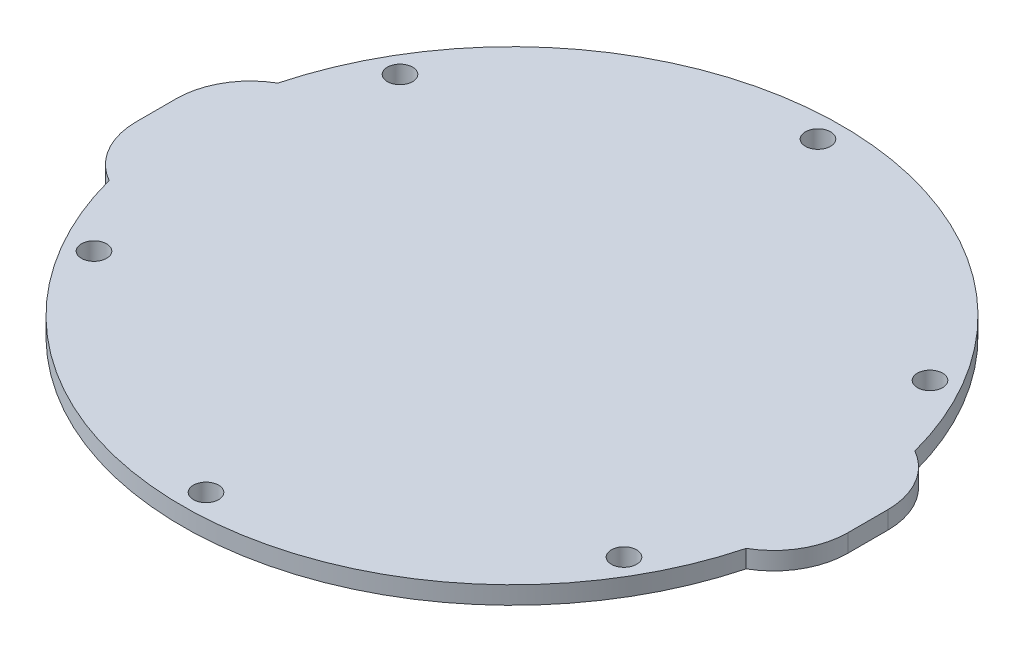
ISO-10303-21;
HEADER;
FILE_DESCRIPTION(('STEP AP214'),'2;1');
FILE_NAME('part.step','',(''),(''),'','','');
FILE_SCHEMA(('AUTOMOTIVE_DESIGN { 1 0 10303 214 1 1 1 1 }'));
ENDSEC;
DATA;
#1=APPLICATION_CONTEXT('core data for automotive mechanical design processes');
#2=APPLICATION_PROTOCOL_DEFINITION('international standard','automotive_design',2000,#1);
#3=PRODUCT_CONTEXT('',#1,'mechanical');
#4=PRODUCT('Part','Part','',(#3));
#5=PRODUCT_RELATED_PRODUCT_CATEGORY('part','',(#4));
#6=PRODUCT_DEFINITION_FORMATION('','',#4);
#7=PRODUCT_DEFINITION_CONTEXT('part definition',#1,'design');
#8=PRODUCT_DEFINITION('design','',#6,#7);
#9=PRODUCT_DEFINITION_SHAPE('','',#8);
#10=(LENGTH_UNIT() NAMED_UNIT(*) SI_UNIT(.MILLI.,.METRE.));
#11=(NAMED_UNIT(*) PLANE_ANGLE_UNIT() SI_UNIT($,.RADIAN.));
#12=(NAMED_UNIT(*) SI_UNIT($,.STERADIAN.) SOLID_ANGLE_UNIT());
#13=UNCERTAINTY_MEASURE_WITH_UNIT(LENGTH_MEASURE(1.E-05),#10,'distance_accuracy_value','');
#14=(GEOMETRIC_REPRESENTATION_CONTEXT(3) GLOBAL_UNCERTAINTY_ASSIGNED_CONTEXT((#13)) GLOBAL_UNIT_ASSIGNED_CONTEXT((#10,
#11,#12)) REPRESENTATION_CONTEXT('',''));
#15=CARTESIAN_POINT('',(0.,0.,0.));
#16=DIRECTION('',(0.,0.,1.));
#17=DIRECTION('',(1.,0.,0.));
#18=AXIS2_PLACEMENT_3D('',#15,#16,#17);
#19=CARTESIAN_POINT('',(-38.,2.4,2.7));
#20=DIRECTION('',(0.,-1.,0.));
#21=DIRECTION('',(0.,0.,-1.));
#22=AXIS2_PLACEMENT_3D('',#19,#20,#21);
#23=CYLINDRICAL_SURFACE('',#22,10.);
#24=CARTESIAN_POINT('',(-38.,0.,2.7));
#25=DIRECTION('',(0.,1.,0.));
#26=DIRECTION('',(0.,0.,1.));
#27=AXIS2_PLACEMENT_3D('',#24,#25,#26);
#28=CIRCLE('',#27,10.);
#29=CARTESIAN_POINT('',(-42.969094343859,0.,11.3780240493922));
#30=VERTEX_POINT('',#29);
#31=CARTESIAN_POINT('',(-48.,0.,2.69999999999993));
#32=VERTEX_POINT('',#31);
#33=EDGE_CURVE('E129',#30,#32,#28,.F.);
#34=ORIENTED_EDGE('',*,*,#33,.F.);
#35=DIRECTION('',(0.,-1.,0.));
#36=VECTOR('',#35,1.);
#37=CARTESIAN_POINT('',(-42.969094343859,2.4,11.3780240493922));
#38=LINE('',#37,#36);
#39=CARTESIAN_POINT('',(-42.969094343859,2.4,11.3780240493922));
#40=VERTEX_POINT('',#39);
#41=EDGE_CURVE('E11',#40,#30,#38,.T.);
#42=ORIENTED_EDGE('',*,*,#41,.F.);
#43=CARTESIAN_POINT('',(-38.,2.4,2.7));
#44=DIRECTION('',(0.,1.,0.));
#45=DIRECTION('',(0.,0.,1.));
#46=AXIS2_PLACEMENT_3D('',#43,#44,#45);
#47=CIRCLE('',#46,10.);
#48=CARTESIAN_POINT('',(-48.,2.4,2.69999999999993));
#49=VERTEX_POINT('',#48);
#50=EDGE_CURVE('E148',#40,#49,#47,.F.);
#51=ORIENTED_EDGE('',*,*,#50,.T.);
#52=DIRECTION('',(0.,-1.,0.));
#53=VECTOR('',#52,1.);
#54=CARTESIAN_POINT('',(-48.,2.4,2.69999999999993));
#55=LINE('',#54,#53);
#56=EDGE_CURVE('E87',#49,#32,#55,.T.);
#57=ORIENTED_EDGE('',*,*,#56,.T.);
#58=EDGE_LOOP('',(#34,#42,#51,#57));
#59=FACE_BOUND('',#58,.T.);
#60=ADVANCED_FACE('F36',(#59),#23,.T.);
#61=CARTESIAN_POINT('',(0.,2.4,0.));
#62=DIRECTION('',(0.,-1.,0.));
#63=DIRECTION('',(0.,0.,-1.));
#64=AXIS2_PLACEMENT_3D('',#61,#62,#63);
#65=CYLINDRICAL_SURFACE('',#64,44.45);
#66=CARTESIAN_POINT('',(0.,0.,0.));
#67=DIRECTION('',(0.,1.,0.));
#68=DIRECTION('',(0.,0.,1.));
#69=AXIS2_PLACEMENT_3D('',#66,#67,#68);
#70=CIRCLE('',#69,44.45);
#71=CARTESIAN_POINT('',(42.969094343859,0.,11.3780240493922));
#72=VERTEX_POINT('',#71);
#73=EDGE_CURVE('E132',#30,#72,#70,.T.);
#74=ORIENTED_EDGE('',*,*,#73,.T.);
#75=DIRECTION('',(0.,-1.,0.));
#76=VECTOR('',#75,1.);
#77=CARTESIAN_POINT('',(42.969094343859,2.4,11.3780240493922));
#78=LINE('',#77,#76);
#79=CARTESIAN_POINT('',(42.969094343859,2.4,11.3780240493922));
#80=VERTEX_POINT('',#79);
#81=EDGE_CURVE('E44',#80,#72,#78,.T.);
#82=ORIENTED_EDGE('',*,*,#81,.F.);
#83=CARTESIAN_POINT('',(0.,2.4,0.));
#84=DIRECTION('',(0.,1.,0.));
#85=DIRECTION('',(0.,0.,1.));
#86=AXIS2_PLACEMENT_3D('',#83,#84,#85);
#87=CIRCLE('',#86,44.45);
#88=EDGE_CURVE('E174',#40,#80,#87,.T.);
#89=ORIENTED_EDGE('',*,*,#88,.F.);
#90=ORIENTED_EDGE('',*,*,#41,.T.);
#91=EDGE_LOOP('',(#74,#82,#89,#90));
#92=FACE_BOUND('',#91,.T.);
#93=ADVANCED_FACE('F247',(#92),#65,.T.);
#94=CARTESIAN_POINT('',(38.,2.4,2.7));
#95=DIRECTION('',(0.,-1.,0.));
#96=DIRECTION('',(0.,0.,-1.));
#97=AXIS2_PLACEMENT_3D('',#94,#95,#96);
#98=CYLINDRICAL_SURFACE('',#97,10.);
#99=CARTESIAN_POINT('',(38.,0.,2.7));
#100=DIRECTION('',(0.,1.,0.));
#101=DIRECTION('',(0.,0.,1.));
#102=AXIS2_PLACEMENT_3D('',#99,#100,#101);
#103=CIRCLE('',#102,10.);
#104=CARTESIAN_POINT('',(48.,0.,2.69999999999993));
#105=VERTEX_POINT('',#104);
#106=EDGE_CURVE('E135',#72,#105,#103,.T.);
#107=ORIENTED_EDGE('',*,*,#106,.T.);
#108=DIRECTION('',(0.,-1.,0.));
#109=VECTOR('',#108,1.);
#110=CARTESIAN_POINT('',(48.,2.4,2.69999999999993));
#111=LINE('',#110,#109);
#112=CARTESIAN_POINT('',(48.,2.4,2.69999999999993));
#113=VERTEX_POINT('',#112);
#114=EDGE_CURVE('E154',#113,#105,#111,.T.);
#115=ORIENTED_EDGE('',*,*,#114,.F.);
#116=CARTESIAN_POINT('',(38.,2.4,2.7));
#117=DIRECTION('',(0.,1.,0.));
#118=DIRECTION('',(0.,0.,1.));
#119=AXIS2_PLACEMENT_3D('',#116,#117,#118);
#120=CIRCLE('',#119,10.);
#121=EDGE_CURVE('E162',#80,#113,#120,.T.);
#122=ORIENTED_EDGE('',*,*,#121,.F.);
#123=ORIENTED_EDGE('',*,*,#81,.T.);
#124=EDGE_LOOP('',(#107,#115,#122,#123));
#125=FACE_BOUND('',#124,.T.);
#126=ADVANCED_FACE('F160',(#125),#98,.T.);
#127=CARTESIAN_POINT('',(48.,2.4,0.));
#128=DIRECTION('',(1.,0.,0.));
#129=DIRECTION('',(0.,0.,-1.));
#130=AXIS2_PLACEMENT_3D('',#127,#128,#129);
#131=PLANE('',#130);
#132=DIRECTION('',(0.,0.,1.));
#133=VECTOR('',#132,1.);
#134=CARTESIAN_POINT('',(48.,0.,0.));
#135=LINE('',#134,#133);
#136=CARTESIAN_POINT('',(48.,0.,-2.69999999999993));
#137=VERTEX_POINT('',#136);
#138=EDGE_CURVE('E138',#137,#105,#135,.T.);
#139=ORIENTED_EDGE('',*,*,#138,.F.);
#140=DIRECTION('',(0.,-1.,0.));
#141=VECTOR('',#140,1.);
#142=CARTESIAN_POINT('',(48.,2.4,-2.69999999999993));
#143=LINE('',#142,#141);
#144=CARTESIAN_POINT('',(48.,2.4,-2.69999999999993));
#145=VERTEX_POINT('',#144);
#146=EDGE_CURVE('E152',#145,#137,#143,.T.);
#147=ORIENTED_EDGE('',*,*,#146,.F.);
#148=DIRECTION('',(0.,0.,1.));
#149=VECTOR('',#148,1.);
#150=CARTESIAN_POINT('',(48.,2.4,0.));
#151=LINE('',#150,#149);
#152=EDGE_CURVE('E172',#145,#113,#151,.T.);
#153=ORIENTED_EDGE('',*,*,#152,.T.);
#154=ORIENTED_EDGE('',*,*,#114,.T.);
#155=EDGE_LOOP('',(#139,#147,#153,#154));
#156=FACE_BOUND('',#155,.T.);
#157=ADVANCED_FACE('F170',(#156),#131,.T.);
#158=CARTESIAN_POINT('',(38.,2.4,-2.7));
#159=DIRECTION('',(0.,-1.,0.));
#160=DIRECTION('',(0.,0.,-1.));
#161=AXIS2_PLACEMENT_3D('',#158,#159,#160);
#162=CYLINDRICAL_SURFACE('',#161,10.);
#163=CARTESIAN_POINT('',(38.,0.,-2.7));
#164=DIRECTION('',(0.,1.,0.));
#165=DIRECTION('',(0.,0.,1.));
#166=AXIS2_PLACEMENT_3D('',#163,#164,#165);
#167=CIRCLE('',#166,10.);
#168=CARTESIAN_POINT('',(42.969094343859,0.,-11.3780240493922));
#169=VERTEX_POINT('',#168);
#170=EDGE_CURVE('E141',#169,#137,#167,.F.);
#171=ORIENTED_EDGE('',*,*,#170,.F.);
#172=DIRECTION('',(0.,-1.,0.));
#173=VECTOR('',#172,1.);
#174=CARTESIAN_POINT('',(42.969094343859,2.4,-11.3780240493922));
#175=LINE('',#174,#173);
#176=CARTESIAN_POINT('',(42.969094343859,2.4,-11.3780240493922));
#177=VERTEX_POINT('',#176);
#178=EDGE_CURVE('E121',#177,#169,#175,.T.);
#179=ORIENTED_EDGE('',*,*,#178,.F.);
#180=CARTESIAN_POINT('',(38.,2.4,-2.7));
#181=DIRECTION('',(0.,1.,0.));
#182=DIRECTION('',(0.,0.,1.));
#183=AXIS2_PLACEMENT_3D('',#180,#181,#182);
#184=CIRCLE('',#183,10.);
#185=EDGE_CURVE('E114',#177,#145,#184,.F.);
#186=ORIENTED_EDGE('',*,*,#185,.T.);
#187=ORIENTED_EDGE('',*,*,#146,.T.);
#188=EDGE_LOOP('',(#171,#179,#186,#187));
#189=FACE_BOUND('',#188,.T.);
#190=ADVANCED_FACE('F262',(#189),#162,.T.);
#191=CARTESIAN_POINT('',(0.,2.4,0.));
#192=DIRECTION('',(0.,-1.,0.));
#193=DIRECTION('',(0.,0.,-1.));
#194=AXIS2_PLACEMENT_3D('',#191,#192,#193);
#195=CYLINDRICAL_SURFACE('',#194,44.45);
#196=CARTESIAN_POINT('',(0.,0.,0.));
#197=DIRECTION('',(0.,1.,0.));
#198=DIRECTION('',(0.,0.,1.));
#199=AXIS2_PLACEMENT_3D('',#196,#197,#198);
#200=CIRCLE('',#199,44.45);
#201=CARTESIAN_POINT('',(-42.969094343859,0.,-11.3780240493922));
#202=VERTEX_POINT('',#201);
#203=EDGE_CURVE('E120',#169,#202,#200,.T.);
#204=ORIENTED_EDGE('',*,*,#203,.T.);
#205=DIRECTION('',(0.,-1.,0.));
#206=VECTOR('',#205,1.);
#207=CARTESIAN_POINT('',(-42.969094343859,2.4,-11.3780240493922));
#208=LINE('',#207,#206);
#209=CARTESIAN_POINT('',(-42.969094343859,2.4,-11.3780240493922));
#210=VERTEX_POINT('',#209);
#211=EDGE_CURVE('E117',#210,#202,#208,.T.);
#212=ORIENTED_EDGE('',*,*,#211,.F.);
#213=CARTESIAN_POINT('',(0.,2.4,0.));
#214=DIRECTION('',(0.,1.,0.));
#215=DIRECTION('',(0.,0.,1.));
#216=AXIS2_PLACEMENT_3D('',#213,#214,#215);
#217=CIRCLE('',#216,44.45);
#218=EDGE_CURVE('E107',#177,#210,#217,.T.);
#219=ORIENTED_EDGE('',*,*,#218,.F.);
#220=ORIENTED_EDGE('',*,*,#178,.T.);
#221=EDGE_LOOP('',(#204,#212,#219,#220));
#222=FACE_BOUND('',#221,.T.);
#223=ADVANCED_FACE('F118',(#222),#195,.T.);
#224=CARTESIAN_POINT('',(-38.,2.4,-2.7));
#225=DIRECTION('',(0.,-1.,0.));
#226=DIRECTION('',(0.,0.,-1.));
#227=AXIS2_PLACEMENT_3D('',#224,#225,#226);
#228=CYLINDRICAL_SURFACE('',#227,10.);
#229=CARTESIAN_POINT('',(-38.,0.,-2.7));
#230=DIRECTION('',(0.,1.,0.));
#231=DIRECTION('',(0.,0.,1.));
#232=AXIS2_PLACEMENT_3D('',#229,#230,#231);
#233=CIRCLE('',#232,10.);
#234=CARTESIAN_POINT('',(-48.,0.,-2.69999999999993));
#235=VERTEX_POINT('',#234);
#236=EDGE_CURVE('E80',#202,#235,#233,.T.);
#237=ORIENTED_EDGE('',*,*,#236,.T.);
#238=DIRECTION('',(0.,-1.,0.));
#239=VECTOR('',#238,1.);
#240=CARTESIAN_POINT('',(-48.,2.4,-2.69999999999993));
#241=LINE('',#240,#239);
#242=CARTESIAN_POINT('',(-48.,2.4,-2.69999999999993));
#243=VERTEX_POINT('',#242);
#244=EDGE_CURVE('E122',#243,#235,#241,.T.);
#245=ORIENTED_EDGE('',*,*,#244,.F.);
#246=CARTESIAN_POINT('',(-38.,2.4,-2.7));
#247=DIRECTION('',(0.,1.,0.));
#248=DIRECTION('',(0.,0.,1.));
#249=AXIS2_PLACEMENT_3D('',#246,#247,#248);
#250=CIRCLE('',#249,10.);
#251=EDGE_CURVE('E111',#210,#243,#250,.T.);
#252=ORIENTED_EDGE('',*,*,#251,.F.);
#253=ORIENTED_EDGE('',*,*,#211,.T.);
#254=EDGE_LOOP('',(#237,#245,#252,#253));
#255=FACE_BOUND('',#254,.T.);
#256=ADVANCED_FACE('F124',(#255),#228,.T.);
#257=CARTESIAN_POINT('',(-48.,2.4,0.));
#258=DIRECTION('',(1.,0.,0.));
#259=DIRECTION('',(0.,0.,-1.));
#260=AXIS2_PLACEMENT_3D('',#257,#258,#259);
#261=PLANE('',#260);
#262=DIRECTION('',(0.,0.,1.));
#263=VECTOR('',#262,1.);
#264=CARTESIAN_POINT('',(-48.,0.,0.));
#265=LINE('',#264,#263);
#266=EDGE_CURVE('E146',#235,#32,#265,.T.);
#267=ORIENTED_EDGE('',*,*,#266,.T.);
#268=ORIENTED_EDGE('',*,*,#56,.F.);
#269=DIRECTION('',(0.,0.,1.));
#270=VECTOR('',#269,1.);
#271=CARTESIAN_POINT('',(-48.,2.4,0.));
#272=LINE('',#271,#270);
#273=EDGE_CURVE('E52',#243,#49,#272,.T.);
#274=ORIENTED_EDGE('',*,*,#273,.F.);
#275=ORIENTED_EDGE('',*,*,#244,.T.);
#276=EDGE_LOOP('',(#267,#268,#274,#275));
#277=FACE_BOUND('',#276,.T.);
#278=ADVANCED_FACE('F219',(#277),#261,.F.);
#279=CARTESIAN_POINT('',(0.,2.4,0.));
#280=DIRECTION('',(0.,1.,0.));
#281=DIRECTION('',(0.,0.,1.));
#282=AXIS2_PLACEMENT_3D('',#279,#280,#281);
#283=PLANE('',#282);
#284=CARTESIAN_POINT('',(35.7451985412025,2.4,-20.6375000000004));
#285=DIRECTION('',(0.,1.,0.));
#286=DIRECTION('',(0.,0.,1.));
#287=AXIS2_PLACEMENT_3D('',#284,#285,#286);
#288=CIRCLE('',#287,1.69999999999999);
#289=CARTESIAN_POINT('',(35.7451985412025,2.4,-18.9375000000004));
#290=VERTEX_POINT('',#289);
#291=EDGE_CURVE('E211',#290,#290,#288,.T.);
#292=ORIENTED_EDGE('',*,*,#291,.F.);
#293=EDGE_LOOP('',(#292));
#294=FACE_BOUND('',#293,.T.);
#295=CARTESIAN_POINT('',(35.7451985412029,2.4,20.6374999999997));
#296=DIRECTION('',(0.,1.,0.));
#297=DIRECTION('',(0.,0.,1.));
#298=AXIS2_PLACEMENT_3D('',#295,#296,#297);
#299=CIRCLE('',#298,1.69999999999999);
#300=CARTESIAN_POINT('',(35.7451985412029,2.4,22.3374999999997));
#301=VERTEX_POINT('',#300);
#302=EDGE_CURVE('E205',#301,#301,#299,.T.);
#303=ORIENTED_EDGE('',*,*,#302,.F.);
#304=EDGE_LOOP('',(#303));
#305=FACE_BOUND('',#304,.T.);
#306=CARTESIAN_POINT('',(0.,2.4,41.275));
#307=DIRECTION('',(0.,1.,0.));
#308=DIRECTION('',(0.,0.,1.));
#309=AXIS2_PLACEMENT_3D('',#306,#307,#308);
#310=CIRCLE('',#309,1.69999999999999);
#311=CARTESIAN_POINT('',(0.,2.4,42.975));
#312=VERTEX_POINT('',#311);
#313=EDGE_CURVE('E199',#312,#312,#310,.T.);
#314=ORIENTED_EDGE('',*,*,#313,.F.);
#315=EDGE_LOOP('',(#314));
#316=FACE_BOUND('',#315,.T.);
#317=CARTESIAN_POINT('',(-35.7451985412026,2.4,20.6375000000002));
#318=DIRECTION('',(0.,1.,0.));
#319=DIRECTION('',(0.,0.,1.));
#320=AXIS2_PLACEMENT_3D('',#317,#318,#319);
#321=CIRCLE('',#320,1.69999999999999);
#322=CARTESIAN_POINT('',(-35.7451985412026,2.4,22.3375000000002));
#323=VERTEX_POINT('',#322);
#324=EDGE_CURVE('E193',#323,#323,#321,.T.);
#325=ORIENTED_EDGE('',*,*,#324,.F.);
#326=EDGE_LOOP('',(#325));
#327=FACE_BOUND('',#326,.T.);
#328=CARTESIAN_POINT('',(-35.7451985412028,2.4,-20.6374999999999));
#329=DIRECTION('',(0.,1.,0.));
#330=DIRECTION('',(0.,0.,1.));
#331=AXIS2_PLACEMENT_3D('',#328,#329,#330);
#332=CIRCLE('',#331,1.69999999999999);
#333=CARTESIAN_POINT('',(-35.7451985412028,2.4,-18.9374999999999));
#334=VERTEX_POINT('',#333);
#335=EDGE_CURVE('E187',#334,#334,#332,.T.);
#336=ORIENTED_EDGE('',*,*,#335,.F.);
#337=EDGE_LOOP('',(#336));
#338=FACE_BOUND('',#337,.T.);
#339=CARTESIAN_POINT('',(0.,2.4,-41.275));
#340=DIRECTION('',(0.,1.,0.));
#341=DIRECTION('',(0.,0.,1.));
#342=AXIS2_PLACEMENT_3D('',#339,#340,#341);
#343=CIRCLE('',#342,1.69999999999999);
#344=CARTESIAN_POINT('',(0.,2.4,-39.575));
#345=VERTEX_POINT('',#344);
#346=EDGE_CURVE('E181',#345,#345,#343,.T.);
#347=ORIENTED_EDGE('',*,*,#346,.F.);
#348=EDGE_LOOP('',(#347));
#349=FACE_BOUND('',#348,.T.);
#350=ORIENTED_EDGE('',*,*,#50,.F.);
#351=ORIENTED_EDGE('',*,*,#88,.T.);
#352=ORIENTED_EDGE('',*,*,#121,.T.);
#353=ORIENTED_EDGE('',*,*,#152,.F.);
#354=ORIENTED_EDGE('',*,*,#185,.F.);
#355=ORIENTED_EDGE('',*,*,#218,.T.);
#356=ORIENTED_EDGE('',*,*,#251,.T.);
#357=ORIENTED_EDGE('',*,*,#273,.T.);
#358=EDGE_LOOP('',(#350,#351,#352,#353,#354,#355,#356,#357));
#359=FACE_BOUND('',#358,.T.);
#360=ADVANCED_FACE('F109',(#294,#305,#316,#327,#338,#349,#359),#283,.T.);
#361=CARTESIAN_POINT('',(0.,0.,0.));
#362=DIRECTION('',(0.,1.,0.));
#363=DIRECTION('',(0.,0.,1.));
#364=AXIS2_PLACEMENT_3D('',#361,#362,#363);
#365=PLANE('',#364);
#366=CARTESIAN_POINT('',(35.7451985412025,0.,-20.6375000000004));
#367=DIRECTION('',(0.,1.,0.));
#368=DIRECTION('',(0.,0.,1.));
#369=AXIS2_PLACEMENT_3D('',#366,#367,#368);
#370=CIRCLE('',#369,1.7);
#371=CARTESIAN_POINT('',(35.7451985412025,0.,-18.9375000000004));
#372=VERTEX_POINT('',#371);
#373=EDGE_CURVE('E208',#372,#372,#370,.T.);
#374=ORIENTED_EDGE('',*,*,#373,.T.);
#375=EDGE_LOOP('',(#374));
#376=FACE_BOUND('',#375,.T.);
#377=CARTESIAN_POINT('',(35.7451985412029,0.,20.6374999999997));
#378=DIRECTION('',(0.,1.,0.));
#379=DIRECTION('',(0.,0.,1.));
#380=AXIS2_PLACEMENT_3D('',#377,#378,#379);
#381=CIRCLE('',#380,1.7);
#382=CARTESIAN_POINT('',(35.7451985412029,0.,22.3374999999997));
#383=VERTEX_POINT('',#382);
#384=EDGE_CURVE('E202',#383,#383,#381,.T.);
#385=ORIENTED_EDGE('',*,*,#384,.T.);
#386=EDGE_LOOP('',(#385));
#387=FACE_BOUND('',#386,.T.);
#388=CARTESIAN_POINT('',(0.,0.,41.275));
#389=DIRECTION('',(0.,1.,0.));
#390=DIRECTION('',(0.,0.,1.));
#391=AXIS2_PLACEMENT_3D('',#388,#389,#390);
#392=CIRCLE('',#391,1.7);
#393=CARTESIAN_POINT('',(0.,0.,42.975));
#394=VERTEX_POINT('',#393);
#395=EDGE_CURVE('E196',#394,#394,#392,.T.);
#396=ORIENTED_EDGE('',*,*,#395,.T.);
#397=EDGE_LOOP('',(#396));
#398=FACE_BOUND('',#397,.T.);
#399=CARTESIAN_POINT('',(-35.7451985412026,0.,20.6375000000002));
#400=DIRECTION('',(0.,1.,0.));
#401=DIRECTION('',(0.,0.,1.));
#402=AXIS2_PLACEMENT_3D('',#399,#400,#401);
#403=CIRCLE('',#402,1.7);
#404=CARTESIAN_POINT('',(-35.7451985412026,0.,22.3375000000002));
#405=VERTEX_POINT('',#404);
#406=EDGE_CURVE('E190',#405,#405,#403,.T.);
#407=ORIENTED_EDGE('',*,*,#406,.T.);
#408=EDGE_LOOP('',(#407));
#409=FACE_BOUND('',#408,.T.);
#410=CARTESIAN_POINT('',(-35.7451985412028,0.,-20.6374999999999));
#411=DIRECTION('',(0.,1.,0.));
#412=DIRECTION('',(0.,0.,1.));
#413=AXIS2_PLACEMENT_3D('',#410,#411,#412);
#414=CIRCLE('',#413,1.7);
#415=CARTESIAN_POINT('',(-35.7451985412028,0.,-18.9374999999999));
#416=VERTEX_POINT('',#415);
#417=EDGE_CURVE('E184',#416,#416,#414,.T.);
#418=ORIENTED_EDGE('',*,*,#417,.T.);
#419=EDGE_LOOP('',(#418));
#420=FACE_BOUND('',#419,.T.);
#421=CARTESIAN_POINT('',(0.,0.,-41.275));
#422=DIRECTION('',(0.,1.,0.));
#423=DIRECTION('',(0.,0.,1.));
#424=AXIS2_PLACEMENT_3D('',#421,#422,#423);
#425=CIRCLE('',#424,1.7);
#426=CARTESIAN_POINT('',(0.,0.,-39.575));
#427=VERTEX_POINT('',#426);
#428=EDGE_CURVE('E133',#427,#427,#425,.T.);
#429=ORIENTED_EDGE('',*,*,#428,.T.);
#430=EDGE_LOOP('',(#429));
#431=FACE_BOUND('',#430,.T.);
#432=ORIENTED_EDGE('',*,*,#33,.T.);
#433=ORIENTED_EDGE('',*,*,#266,.F.);
#434=ORIENTED_EDGE('',*,*,#236,.F.);
#435=ORIENTED_EDGE('',*,*,#203,.F.);
#436=ORIENTED_EDGE('',*,*,#170,.T.);
#437=ORIENTED_EDGE('',*,*,#138,.T.);
#438=ORIENTED_EDGE('',*,*,#106,.F.);
#439=ORIENTED_EDGE('',*,*,#73,.F.);
#440=EDGE_LOOP('',(#432,#433,#434,#435,#436,#437,#438,#439));
#441=FACE_BOUND('',#440,.T.);
#442=ADVANCED_FACE('F166',(#376,#387,#398,#409,#420,#431,#441),#365,.F.);
#443=CARTESIAN_POINT('',(0.,2.4,-41.275));
#444=DIRECTION('',(0.,1.,0.));
#445=DIRECTION('',(0.,0.,1.));
#446=AXIS2_PLACEMENT_3D('',#443,#444,#445);
#447=CYLINDRICAL_SURFACE('',#446,1.69999999999999);
#448=ORIENTED_EDGE('',*,*,#428,.F.);
#449=EDGE_LOOP('',(#448));
#450=FACE_BOUND('',#449,.T.);
#451=ORIENTED_EDGE('',*,*,#346,.T.);
#452=EDGE_LOOP('',(#451));
#453=FACE_BOUND('',#452,.T.);
#454=ADVANCED_FACE('F231',(#450,#453),#447,.F.);
#455=CARTESIAN_POINT('',(-35.7451985412028,2.4,-20.6374999999999));
#456=DIRECTION('',(0.,1.,0.));
#457=DIRECTION('',(0.,0.,1.));
#458=AXIS2_PLACEMENT_3D('',#455,#456,#457);
#459=CYLINDRICAL_SURFACE('',#458,1.69999999999999);
#460=ORIENTED_EDGE('',*,*,#417,.F.);
#461=EDGE_LOOP('',(#460));
#462=FACE_BOUND('',#461,.T.);
#463=ORIENTED_EDGE('',*,*,#335,.T.);
#464=EDGE_LOOP('',(#463));
#465=FACE_BOUND('',#464,.T.);
#466=ADVANCED_FACE('F233',(#462,#465),#459,.F.);
#467=CARTESIAN_POINT('',(-35.7451985412026,2.4,20.6375000000002));
#468=DIRECTION('',(0.,1.,0.));
#469=DIRECTION('',(0.,0.,1.));
#470=AXIS2_PLACEMENT_3D('',#467,#468,#469);
#471=CYLINDRICAL_SURFACE('',#470,1.69999999999999);
#472=ORIENTED_EDGE('',*,*,#406,.F.);
#473=EDGE_LOOP('',(#472));
#474=FACE_BOUND('',#473,.T.);
#475=ORIENTED_EDGE('',*,*,#324,.T.);
#476=EDGE_LOOP('',(#475));
#477=FACE_BOUND('',#476,.T.);
#478=ADVANCED_FACE('F240',(#474,#477),#471,.F.);
#479=CARTESIAN_POINT('',(0.,2.4,41.275));
#480=DIRECTION('',(0.,1.,0.));
#481=DIRECTION('',(0.,0.,1.));
#482=AXIS2_PLACEMENT_3D('',#479,#480,#481);
#483=CYLINDRICAL_SURFACE('',#482,1.69999999999999);
#484=ORIENTED_EDGE('',*,*,#395,.F.);
#485=EDGE_LOOP('',(#484));
#486=FACE_BOUND('',#485,.T.);
#487=ORIENTED_EDGE('',*,*,#313,.T.);
#488=EDGE_LOOP('',(#487));
#489=FACE_BOUND('',#488,.T.);
#490=ADVANCED_FACE('F328',(#486,#489),#483,.F.);
#491=CARTESIAN_POINT('',(35.7451985412029,2.4,20.6374999999997));
#492=DIRECTION('',(0.,1.,0.));
#493=DIRECTION('',(0.,0.,1.));
#494=AXIS2_PLACEMENT_3D('',#491,#492,#493);
#495=CYLINDRICAL_SURFACE('',#494,1.69999999999999);
#496=ORIENTED_EDGE('',*,*,#384,.F.);
#497=EDGE_LOOP('',(#496));
#498=FACE_BOUND('',#497,.T.);
#499=ORIENTED_EDGE('',*,*,#302,.T.);
#500=EDGE_LOOP('',(#499));
#501=FACE_BOUND('',#500,.T.);
#502=ADVANCED_FACE('F338',(#498,#501),#495,.F.);
#503=CARTESIAN_POINT('',(35.7451985412025,2.4,-20.6375000000004));
#504=DIRECTION('',(0.,1.,0.));
#505=DIRECTION('',(0.,0.,1.));
#506=AXIS2_PLACEMENT_3D('',#503,#504,#505);
#507=CYLINDRICAL_SURFACE('',#506,1.69999999999999);
#508=ORIENTED_EDGE('',*,*,#373,.F.);
#509=EDGE_LOOP('',(#508));
#510=FACE_BOUND('',#509,.T.);
#511=ORIENTED_EDGE('',*,*,#291,.T.);
#512=EDGE_LOOP('',(#511));
#513=FACE_BOUND('',#512,.T.);
#514=ADVANCED_FACE('F215',(#510,#513),#507,.F.);
#515=CLOSED_SHELL('',(#60,#93,#126,#157,#190,#223,#256,#278,#360,#442,#454,#466,#478,#490,#502,#514));
#516=MANIFOLD_SOLID_BREP('B2',#515);
#517=ADVANCED_BREP_SHAPE_REPRESENTATION('',(#18,#516),#14);
#518=SHAPE_DEFINITION_REPRESENTATION(#9,#517);
ENDSEC;
END-ISO-10303-21;
